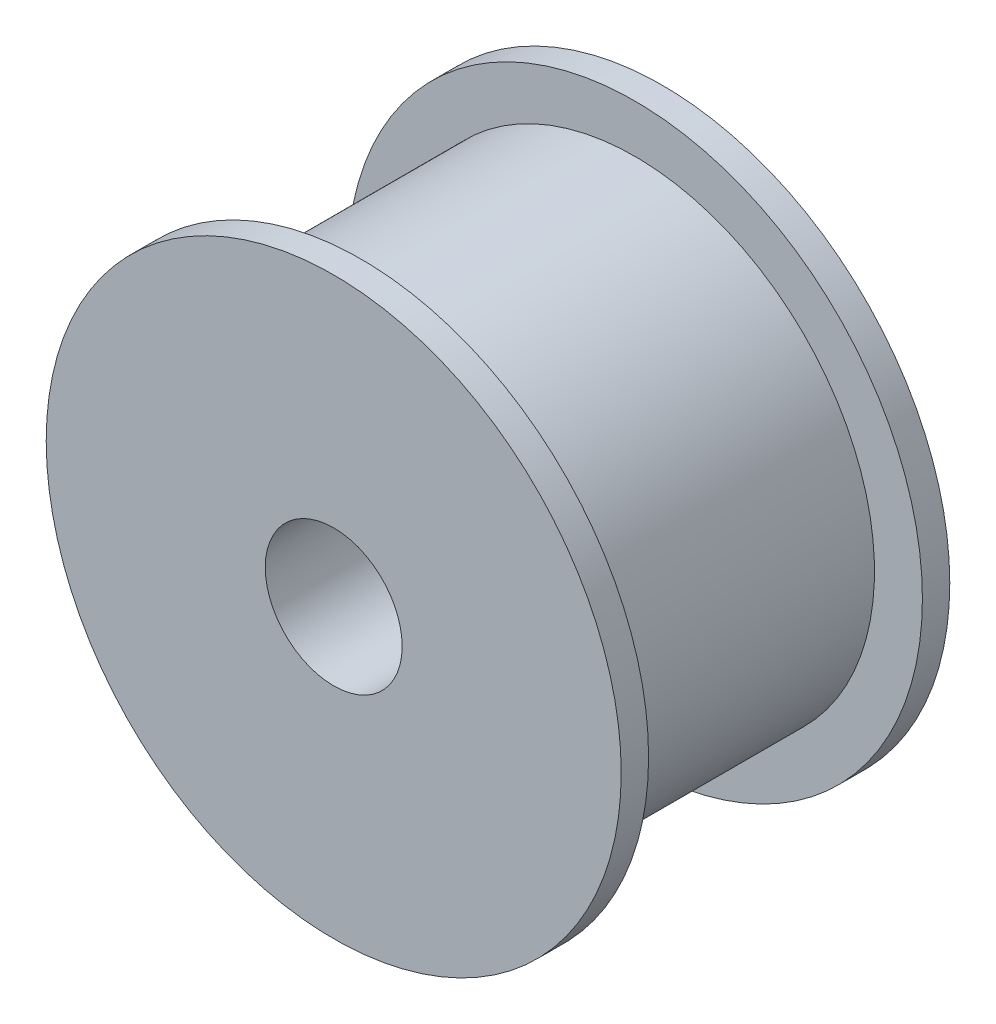
ISO-10303-21;
HEADER;
FILE_DESCRIPTION(('STEP AP214'),'2;1');
FILE_NAME('part.step','',(''),(''),'','','');
FILE_SCHEMA(('AUTOMOTIVE_DESIGN { 1 0 10303 214 1 1 1 1 }'));
ENDSEC;
DATA;
#1=APPLICATION_CONTEXT('core data for automotive mechanical design processes');
#2=APPLICATION_PROTOCOL_DEFINITION('international standard','automotive_design',2000,#1);
#3=PRODUCT_CONTEXT('',#1,'mechanical');
#4=PRODUCT('Part','Part','',(#3));
#5=PRODUCT_RELATED_PRODUCT_CATEGORY('part','',(#4));
#6=PRODUCT_DEFINITION_FORMATION('','',#4);
#7=PRODUCT_DEFINITION_CONTEXT('part definition',#1,'design');
#8=PRODUCT_DEFINITION('design','',#6,#7);
#9=PRODUCT_DEFINITION_SHAPE('','',#8);
#10=(LENGTH_UNIT() NAMED_UNIT(*) SI_UNIT(.MILLI.,.METRE.));
#11=(NAMED_UNIT(*) PLANE_ANGLE_UNIT() SI_UNIT($,.RADIAN.));
#12=(NAMED_UNIT(*) SI_UNIT($,.STERADIAN.) SOLID_ANGLE_UNIT());
#13=UNCERTAINTY_MEASURE_WITH_UNIT(LENGTH_MEASURE(1.E-05),#10,'distance_accuracy_value','');
#14=(GEOMETRIC_REPRESENTATION_CONTEXT(3) GLOBAL_UNCERTAINTY_ASSIGNED_CONTEXT((#13)) GLOBAL_UNIT_ASSIGNED_CONTEXT((#10,
#11,#12)) REPRESENTATION_CONTEXT('',''));
#15=CARTESIAN_POINT('',(0.,0.,0.));
#16=DIRECTION('',(0.,0.,1.));
#17=DIRECTION('',(1.,0.,0.));
#18=AXIS2_PLACEMENT_3D('',#15,#16,#17);
#19=CARTESIAN_POINT('',(0.,0.,1.));
#20=DIRECTION('',(0.,0.,-1.));
#21=DIRECTION('',(-1.,0.,0.));
#22=AXIS2_PLACEMENT_3D('',#19,#20,#21);
#23=CYLINDRICAL_SURFACE('',#22,2.5);
#24=CARTESIAN_POINT('',(0.,0.,1.));
#25=DIRECTION('',(0.,0.,1.));
#26=DIRECTION('',(1.,0.,0.));
#27=AXIS2_PLACEMENT_3D('',#24,#25,#26);
#28=CIRCLE('',#27,2.5);
#29=CARTESIAN_POINT('',(2.5,0.,1.));
#30=VERTEX_POINT('',#29);
#31=EDGE_CURVE('E50',#30,#30,#28,.T.);
#32=ORIENTED_EDGE('',*,*,#31,.T.);
#33=EDGE_LOOP('',(#32));
#34=FACE_BOUND('',#33,.T.);
#35=CARTESIAN_POINT('',(0.,0.,-11.));
#36=DIRECTION('',(0.,0.,-1.));
#37=DIRECTION('',(-1.,0.,0.));
#38=AXIS2_PLACEMENT_3D('',#35,#36,#37);
#39=CIRCLE('',#38,2.5);
#40=CARTESIAN_POINT('',(-2.5,0.,-11.));
#41=VERTEX_POINT('',#40);
#42=EDGE_CURVE('E71',#41,#41,#39,.T.);
#43=ORIENTED_EDGE('',*,*,#42,.T.);
#44=EDGE_LOOP('',(#43));
#45=FACE_BOUND('',#44,.T.);
#46=ADVANCED_FACE('F38',(#34,#45),#23,.F.);
#47=CARTESIAN_POINT('',(0.,0.,1.));
#48=DIRECTION('',(0.,0.,-1.));
#49=DIRECTION('',(-1.,0.,0.));
#50=AXIS2_PLACEMENT_3D('',#47,#48,#49);
#51=CYLINDRICAL_SURFACE('',#50,10.5);
#52=CARTESIAN_POINT('',(0.,0.,1.));
#53=DIRECTION('',(0.,0.,1.));
#54=DIRECTION('',(1.,0.,0.));
#55=AXIS2_PLACEMENT_3D('',#52,#53,#54);
#56=CIRCLE('',#55,10.5);
#57=CARTESIAN_POINT('',(10.5,0.,1.));
#58=VERTEX_POINT('',#57);
#59=EDGE_CURVE('E45',#58,#58,#56,.T.);
#60=ORIENTED_EDGE('',*,*,#59,.F.);
#61=EDGE_LOOP('',(#60));
#62=FACE_BOUND('',#61,.T.);
#63=CARTESIAN_POINT('',(0.,0.,0.));
#64=DIRECTION('',(0.,0.,1.));
#65=DIRECTION('',(1.,0.,0.));
#66=AXIS2_PLACEMENT_3D('',#63,#64,#65);
#67=CIRCLE('',#66,10.5);
#68=CARTESIAN_POINT('',(10.5,0.,0.));
#69=VERTEX_POINT('',#68);
#70=EDGE_CURVE('E41',#69,#69,#67,.T.);
#71=ORIENTED_EDGE('',*,*,#70,.T.);
#72=EDGE_LOOP('',(#71));
#73=FACE_BOUND('',#72,.T.);
#74=ADVANCED_FACE('F92',(#62,#73),#51,.T.);
#75=CARTESIAN_POINT('',(0.,0.,1.));
#76=DIRECTION('',(0.,0.,1.));
#77=DIRECTION('',(1.,0.,0.));
#78=AXIS2_PLACEMENT_3D('',#75,#76,#77);
#79=PLANE('',#78);
#80=ORIENTED_EDGE('',*,*,#31,.F.);
#81=EDGE_LOOP('',(#80));
#82=FACE_BOUND('',#81,.T.);
#83=ORIENTED_EDGE('',*,*,#59,.T.);
#84=EDGE_LOOP('',(#83));
#85=FACE_BOUND('',#84,.T.);
#86=ADVANCED_FACE('F96',(#82,#85),#79,.T.);
#87=CARTESIAN_POINT('',(0.,0.,0.));
#88=DIRECTION('',(0.,0.,1.));
#89=DIRECTION('',(1.,0.,0.));
#90=AXIS2_PLACEMENT_3D('',#87,#88,#89);
#91=PLANE('',#90);
#92=CARTESIAN_POINT('',(0.,0.,0.));
#93=DIRECTION('',(0.,0.,-1.));
#94=DIRECTION('',(-1.,0.,0.));
#95=AXIS2_PLACEMENT_3D('',#92,#93,#94);
#96=CIRCLE('',#95,8.75);
#97=CARTESIAN_POINT('',(-8.75,0.,0.));
#98=VERTEX_POINT('',#97);
#99=EDGE_CURVE('E10',#98,#98,#96,.T.);
#100=ORIENTED_EDGE('',*,*,#99,.F.);
#101=EDGE_LOOP('',(#100));
#102=FACE_BOUND('',#101,.T.);
#103=ORIENTED_EDGE('',*,*,#70,.F.);
#104=EDGE_LOOP('',(#103));
#105=FACE_BOUND('',#104,.T.);
#106=ADVANCED_FACE('F88',(#102,#105),#91,.F.);
#107=CARTESIAN_POINT('',(0.,0.,-10.));
#108=DIRECTION('',(0.,0.,1.));
#109=DIRECTION('',(1.,0.,0.));
#110=AXIS2_PLACEMENT_3D('',#107,#108,#109);
#111=CYLINDRICAL_SURFACE('',#110,8.75);
#112=CARTESIAN_POINT('',(0.,0.,-10.));
#113=DIRECTION('',(0.,0.,-1.));
#114=DIRECTION('',(-1.,0.,0.));
#115=AXIS2_PLACEMENT_3D('',#112,#113,#114);
#116=CIRCLE('',#115,8.75);
#117=CARTESIAN_POINT('',(-8.75,0.,-10.));
#118=VERTEX_POINT('',#117);
#119=EDGE_CURVE('E53',#118,#118,#116,.T.);
#120=ORIENTED_EDGE('',*,*,#119,.F.);
#121=EDGE_LOOP('',(#120));
#122=FACE_BOUND('',#121,.T.);
#123=ORIENTED_EDGE('',*,*,#99,.T.);
#124=EDGE_LOOP('',(#123));
#125=FACE_BOUND('',#124,.T.);
#126=ADVANCED_FACE('F80',(#122,#125),#111,.T.);
#127=CARTESIAN_POINT('',(0.,0.,-11.));
#128=DIRECTION('',(0.,0.,-1.));
#129=DIRECTION('',(-1.,0.,0.));
#130=AXIS2_PLACEMENT_3D('',#127,#128,#129);
#131=PLANE('',#130);
#132=CARTESIAN_POINT('',(0.,0.,-11.));
#133=DIRECTION('',(0.,0.,-1.));
#134=DIRECTION('',(-1.,0.,0.));
#135=AXIS2_PLACEMENT_3D('',#132,#133,#134);
#136=CIRCLE('',#135,10.5);
#137=CARTESIAN_POINT('',(-10.5,0.,-11.));
#138=VERTEX_POINT('',#137);
#139=EDGE_CURVE('E62',#138,#138,#136,.T.);
#140=ORIENTED_EDGE('',*,*,#139,.T.);
#141=EDGE_LOOP('',(#140));
#142=FACE_BOUND('',#141,.T.);
#143=ORIENTED_EDGE('',*,*,#42,.F.);
#144=EDGE_LOOP('',(#143));
#145=FACE_BOUND('',#144,.T.);
#146=ADVANCED_FACE('F77',(#142,#145),#131,.T.);
#147=CARTESIAN_POINT('',(0.,0.,-10.));
#148=DIRECTION('',(0.,0.,-1.));
#149=DIRECTION('',(-1.,0.,0.));
#150=AXIS2_PLACEMENT_3D('',#147,#148,#149);
#151=PLANE('',#150);
#152=ORIENTED_EDGE('',*,*,#119,.T.);
#153=EDGE_LOOP('',(#152));
#154=FACE_BOUND('',#153,.T.);
#155=CARTESIAN_POINT('',(0.,0.,-10.));
#156=DIRECTION('',(0.,0.,-1.));
#157=DIRECTION('',(-1.,0.,0.));
#158=AXIS2_PLACEMENT_3D('',#155,#156,#157);
#159=CIRCLE('',#158,10.5);
#160=CARTESIAN_POINT('',(-10.5,0.,-10.));
#161=VERTEX_POINT('',#160);
#162=EDGE_CURVE('E66',#161,#161,#159,.T.);
#163=ORIENTED_EDGE('',*,*,#162,.F.);
#164=EDGE_LOOP('',(#163));
#165=FACE_BOUND('',#164,.T.);
#166=ADVANCED_FACE('F79',(#154,#165),#151,.F.);
#167=CARTESIAN_POINT('',(0.,0.,-11.));
#168=DIRECTION('',(0.,0.,1.));
#169=DIRECTION('',(1.,0.,0.));
#170=AXIS2_PLACEMENT_3D('',#167,#168,#169);
#171=CYLINDRICAL_SURFACE('',#170,10.5);
#172=ORIENTED_EDGE('',*,*,#139,.F.);
#173=EDGE_LOOP('',(#172));
#174=FACE_BOUND('',#173,.T.);
#175=ORIENTED_EDGE('',*,*,#162,.T.);
#176=EDGE_LOOP('',(#175));
#177=FACE_BOUND('',#176,.T.);
#178=ADVANCED_FACE('F86',(#174,#177),#171,.T.);
#179=CLOSED_SHELL('',(#46,#74,#86,#106,#126,#146,#166,#178));
#180=MANIFOLD_SOLID_BREP('B2',#179);
#181=ADVANCED_BREP_SHAPE_REPRESENTATION('',(#18,#180),#14);
#182=SHAPE_DEFINITION_REPRESENTATION(#9,#181);
ENDSEC;
END-ISO-10303-21;
